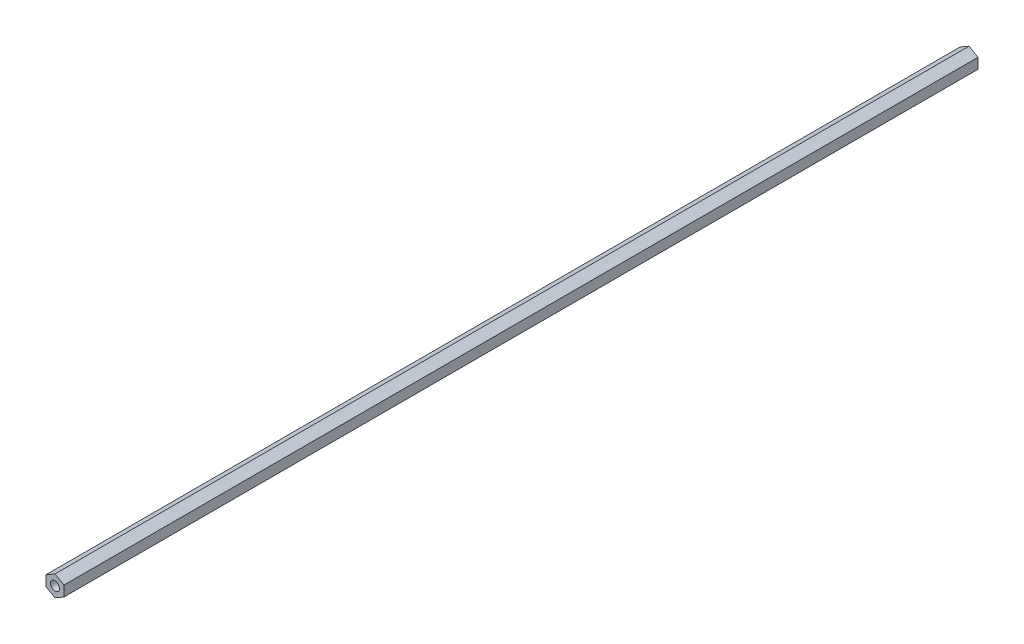
ISO-10303-21;
HEADER;
FILE_DESCRIPTION(('STEP AP214'),'2;1');
FILE_NAME('part.step','',(''),(''),'','','');
FILE_SCHEMA(('AUTOMOTIVE_DESIGN { 1 0 10303 214 1 1 1 1 }'));
ENDSEC;
DATA;
#1=APPLICATION_CONTEXT('core data for automotive mechanical design processes');
#2=APPLICATION_PROTOCOL_DEFINITION('international standard','automotive_design',2000,#1);
#3=PRODUCT_CONTEXT('',#1,'mechanical');
#4=PRODUCT('Part','Part','',(#3));
#5=PRODUCT_RELATED_PRODUCT_CATEGORY('part','',(#4));
#6=PRODUCT_DEFINITION_FORMATION('','',#4);
#7=PRODUCT_DEFINITION_CONTEXT('part definition',#1,'design');
#8=PRODUCT_DEFINITION('design','',#6,#7);
#9=PRODUCT_DEFINITION_SHAPE('','',#8);
#10=(LENGTH_UNIT() NAMED_UNIT(*) SI_UNIT(.MILLI.,.METRE.));
#11=(NAMED_UNIT(*) PLANE_ANGLE_UNIT() SI_UNIT($,.RADIAN.));
#12=(NAMED_UNIT(*) SI_UNIT($,.STERADIAN.) SOLID_ANGLE_UNIT());
#13=UNCERTAINTY_MEASURE_WITH_UNIT(LENGTH_MEASURE(1.E-05),#10,'distance_accuracy_value','');
#14=(GEOMETRIC_REPRESENTATION_CONTEXT(3) GLOBAL_UNCERTAINTY_ASSIGNED_CONTEXT((#13)) GLOBAL_UNIT_ASSIGNED_CONTEXT((#10,
#11,#12)) REPRESENTATION_CONTEXT('',''));
#15=CARTESIAN_POINT('',(0.,0.,0.));
#16=DIRECTION('',(0.,0.,1.));
#17=DIRECTION('',(1.,0.,0.));
#18=AXIS2_PLACEMENT_3D('',#15,#16,#17);
#19=CARTESIAN_POINT('',(-6.35,3.66617420935411,323.85));
#20=DIRECTION('',(1.,0.,0.));
#21=DIRECTION('',(0.,0.,-1.));
#22=AXIS2_PLACEMENT_3D('',#19,#20,#21);
#23=PLANE('',#22);
#24=DIRECTION('',(0.,0.,-1.));
#25=VECTOR('',#24,1.);
#26=CARTESIAN_POINT('',(-6.35,3.66617420935411,323.85));
#27=LINE('',#26,#25);
#28=CARTESIAN_POINT('',(-6.35,3.66617420935411,323.85));
#29=VERTEX_POINT('',#28);
#30=CARTESIAN_POINT('',(-6.35,3.66617420935411,-323.85));
#31=VERTEX_POINT('',#30);
#32=EDGE_CURVE('E140',#29,#31,#27,.T.);
#33=ORIENTED_EDGE('',*,*,#32,.T.);
#34=DIRECTION('',(0.,-1.,0.));
#35=VECTOR('',#34,1.);
#36=CARTESIAN_POINT('',(-6.35,3.66617420935411,-323.85));
#37=LINE('',#36,#35);
#38=CARTESIAN_POINT('',(-6.35,-3.66617420935413,-323.85));
#39=VERTEX_POINT('',#38);
#40=EDGE_CURVE('E112',#31,#39,#37,.T.);
#41=ORIENTED_EDGE('',*,*,#40,.T.);
#42=DIRECTION('',(0.,0.,-1.));
#43=VECTOR('',#42,1.);
#44=CARTESIAN_POINT('',(-6.35,-3.66617420935413,323.85));
#45=LINE('',#44,#43);
#46=CARTESIAN_POINT('',(-6.35,-3.66617420935413,323.85));
#47=VERTEX_POINT('',#46);
#48=EDGE_CURVE('E11',#47,#39,#45,.T.);
#49=ORIENTED_EDGE('',*,*,#48,.F.);
#50=DIRECTION('',(0.,-1.,0.));
#51=VECTOR('',#50,1.);
#52=CARTESIAN_POINT('',(-6.35,3.66617420935411,323.85));
#53=LINE('',#52,#51);
#54=EDGE_CURVE('E130',#29,#47,#53,.T.);
#55=ORIENTED_EDGE('',*,*,#54,.F.);
#56=EDGE_LOOP('',(#33,#41,#49,#55));
#57=FACE_BOUND('',#56,.T.);
#58=ADVANCED_FACE('F36',(#57),#23,.F.);
#59=CARTESIAN_POINT('',(-6.35,-3.66617420935413,323.85));
#60=DIRECTION('',(0.5,0.866025403784439,0.));
#61=DIRECTION('',(-0.866025403784439,0.5,0.));
#62=AXIS2_PLACEMENT_3D('',#59,#60,#61);
#63=PLANE('',#62);
#64=ORIENTED_EDGE('',*,*,#48,.T.);
#65=DIRECTION('',(0.866025403784439,-0.5,0.));
#66=VECTOR('',#65,1.);
#67=CARTESIAN_POINT('',(-6.35,-3.66617420935413,-323.85));
#68=LINE('',#67,#66);
#69=CARTESIAN_POINT('',(0.,-7.33234841870826,-323.85));
#70=VERTEX_POINT('',#69);
#71=EDGE_CURVE('E115',#39,#70,#68,.T.);
#72=ORIENTED_EDGE('',*,*,#71,.T.);
#73=DIRECTION('',(0.,0.,-1.));
#74=VECTOR('',#73,1.);
#75=CARTESIAN_POINT('',(0.,-7.33234841870826,323.85));
#76=LINE('',#75,#74);
#77=CARTESIAN_POINT('',(0.,-7.33234841870826,323.85));
#78=VERTEX_POINT('',#77);
#79=EDGE_CURVE('E43',#78,#70,#76,.T.);
#80=ORIENTED_EDGE('',*,*,#79,.F.);
#81=DIRECTION('',(0.866025403784439,-0.5,0.));
#82=VECTOR('',#81,1.);
#83=CARTESIAN_POINT('',(-6.35,-3.66617420935413,323.85));
#84=LINE('',#83,#82);
#85=EDGE_CURVE('E132',#47,#78,#84,.T.);
#86=ORIENTED_EDGE('',*,*,#85,.F.);
#87=EDGE_LOOP('',(#64,#72,#80,#86));
#88=FACE_BOUND('',#87,.T.);
#89=ADVANCED_FACE('F160',(#88),#63,.F.);
#90=CARTESIAN_POINT('',(0.,-7.33234841870826,323.85));
#91=DIRECTION('',(-0.5,0.866025403784439,0.));
#92=DIRECTION('',(-0.866025403784439,-0.5,0.));
#93=AXIS2_PLACEMENT_3D('',#90,#91,#92);
#94=PLANE('',#93);
#95=ORIENTED_EDGE('',*,*,#79,.T.);
#96=DIRECTION('',(0.866025403784439,0.5,0.));
#97=VECTOR('',#96,1.);
#98=CARTESIAN_POINT('',(0.,-7.33234841870826,-323.85));
#99=LINE('',#98,#97);
#100=CARTESIAN_POINT('',(6.35,-3.66617420935414,-323.85));
#101=VERTEX_POINT('',#100);
#102=EDGE_CURVE('E118',#70,#101,#99,.T.);
#103=ORIENTED_EDGE('',*,*,#102,.T.);
#104=DIRECTION('',(0.,0.,-1.));
#105=VECTOR('',#104,1.);
#106=CARTESIAN_POINT('',(6.35,-3.66617420935414,323.85));
#107=LINE('',#106,#105);
#108=CARTESIAN_POINT('',(6.35,-3.66617420935414,323.85));
#109=VERTEX_POINT('',#108);
#110=EDGE_CURVE('E146',#109,#101,#107,.T.);
#111=ORIENTED_EDGE('',*,*,#110,.F.);
#112=DIRECTION('',(0.866025403784439,0.5,0.));
#113=VECTOR('',#112,1.);
#114=CARTESIAN_POINT('',(0.,-7.33234841870826,323.85));
#115=LINE('',#114,#113);
#116=EDGE_CURVE('E134',#78,#109,#115,.T.);
#117=ORIENTED_EDGE('',*,*,#116,.F.);
#118=EDGE_LOOP('',(#95,#103,#111,#117));
#119=FACE_BOUND('',#118,.T.);
#120=ADVANCED_FACE('F151',(#119),#94,.F.);
#121=CARTESIAN_POINT('',(6.35,-3.66617420935414,323.85));
#122=DIRECTION('',(-1.,0.,0.));
#123=DIRECTION('',(0.,-1.,0.));
#124=AXIS2_PLACEMENT_3D('',#121,#122,#123);
#125=PLANE('',#124);
#126=ORIENTED_EDGE('',*,*,#110,.T.);
#127=DIRECTION('',(0.,1.,0.));
#128=VECTOR('',#127,1.);
#129=CARTESIAN_POINT('',(6.35,-3.66617420935414,-323.85));
#130=LINE('',#129,#128);
#131=CARTESIAN_POINT('',(6.35,3.66617420935412,-323.85));
#132=VERTEX_POINT('',#131);
#133=EDGE_CURVE('E121',#101,#132,#130,.T.);
#134=ORIENTED_EDGE('',*,*,#133,.T.);
#135=DIRECTION('',(0.,0.,-1.));
#136=VECTOR('',#135,1.);
#137=CARTESIAN_POINT('',(6.35,3.66617420935412,323.85));
#138=LINE('',#137,#136);
#139=CARTESIAN_POINT('',(6.35,3.66617420935412,323.85));
#140=VERTEX_POINT('',#139);
#141=EDGE_CURVE('E144',#140,#132,#138,.T.);
#142=ORIENTED_EDGE('',*,*,#141,.F.);
#143=DIRECTION('',(0.,1.,0.));
#144=VECTOR('',#143,1.);
#145=CARTESIAN_POINT('',(6.35,-3.66617420935414,323.85));
#146=LINE('',#145,#144);
#147=EDGE_CURVE('E136',#109,#140,#146,.T.);
#148=ORIENTED_EDGE('',*,*,#147,.F.);
#149=EDGE_LOOP('',(#126,#134,#142,#148));
#150=FACE_BOUND('',#149,.T.);
#151=ADVANCED_FACE('F171',(#150),#125,.F.);
#152=CARTESIAN_POINT('',(6.35,3.66617420935412,323.85));
#153=DIRECTION('',(-0.5,-0.866025403784439,0.));
#154=DIRECTION('',(0.866025403784439,-0.5,0.));
#155=AXIS2_PLACEMENT_3D('',#152,#153,#154);
#156=PLANE('',#155);
#157=ORIENTED_EDGE('',*,*,#141,.T.);
#158=DIRECTION('',(-0.866025403784439,0.5,0.));
#159=VECTOR('',#158,1.);
#160=CARTESIAN_POINT('',(6.35,3.66617420935412,-323.85));
#161=LINE('',#160,#159);
#162=CARTESIAN_POINT('',(0.,7.33234841870824,-323.85));
#163=VERTEX_POINT('',#162);
#164=EDGE_CURVE('E124',#132,#163,#161,.T.);
#165=ORIENTED_EDGE('',*,*,#164,.T.);
#166=DIRECTION('',(0.,0.,-1.));
#167=VECTOR('',#166,1.);
#168=CARTESIAN_POINT('',(0.,7.33234841870824,323.85));
#169=LINE('',#168,#167);
#170=CARTESIAN_POINT('',(0.,7.33234841870824,323.85));
#171=VERTEX_POINT('',#170);
#172=EDGE_CURVE('E142',#171,#163,#169,.T.);
#173=ORIENTED_EDGE('',*,*,#172,.F.);
#174=DIRECTION('',(-0.866025403784439,0.5,0.));
#175=VECTOR('',#174,1.);
#176=CARTESIAN_POINT('',(6.35,3.66617420935412,323.85));
#177=LINE('',#176,#175);
#178=EDGE_CURVE('E55',#140,#171,#177,.T.);
#179=ORIENTED_EDGE('',*,*,#178,.F.);
#180=EDGE_LOOP('',(#157,#165,#173,#179));
#181=FACE_BOUND('',#180,.T.);
#182=ADVANCED_FACE('F168',(#181),#156,.F.);
#183=CARTESIAN_POINT('',(0.,7.33234841870824,323.85));
#184=DIRECTION('',(0.5,-0.866025403784439,0.));
#185=DIRECTION('',(0.866025403784439,0.5,0.));
#186=AXIS2_PLACEMENT_3D('',#183,#184,#185);
#187=PLANE('',#186);
#188=ORIENTED_EDGE('',*,*,#172,.T.);
#189=DIRECTION('',(-0.866025403784439,-0.5,0.));
#190=VECTOR('',#189,1.);
#191=CARTESIAN_POINT('',(0.,7.33234841870824,-323.85));
#192=LINE('',#191,#190);
#193=EDGE_CURVE('E127',#163,#31,#192,.T.);
#194=ORIENTED_EDGE('',*,*,#193,.T.);
#195=ORIENTED_EDGE('',*,*,#32,.F.);
#196=DIRECTION('',(-0.866025403784439,-0.5,0.));
#197=VECTOR('',#196,1.);
#198=CARTESIAN_POINT('',(0.,7.33234841870824,323.85));
#199=LINE('',#198,#197);
#200=EDGE_CURVE('E50',#171,#29,#199,.T.);
#201=ORIENTED_EDGE('',*,*,#200,.F.);
#202=EDGE_LOOP('',(#188,#194,#195,#201));
#203=FACE_BOUND('',#202,.T.);
#204=ADVANCED_FACE('F166',(#203),#187,.F.);
#205=CARTESIAN_POINT('',(0.,0.,323.85));
#206=DIRECTION('',(0.,0.,1.));
#207=DIRECTION('',(1.,0.,0.));
#208=AXIS2_PLACEMENT_3D('',#205,#206,#207);
#209=PLANE('',#208);
#210=CARTESIAN_POINT('',(0.,0.,323.85));
#211=DIRECTION('',(0.,0.,1.));
#212=DIRECTION('',(1.,0.,0.));
#213=AXIS2_PLACEMENT_3D('',#210,#211,#212);
#214=CIRCLE('',#213,3.17499999999999);
#215=CARTESIAN_POINT('',(3.17499999999999,0.,323.85));
#216=VERTEX_POINT('',#215);
#217=EDGE_CURVE('E101',#216,#216,#214,.T.);
#218=ORIENTED_EDGE('',*,*,#217,.F.);
#219=EDGE_LOOP('',(#218));
#220=FACE_BOUND('',#219,.T.);
#221=ORIENTED_EDGE('',*,*,#54,.T.);
#222=ORIENTED_EDGE('',*,*,#85,.T.);
#223=ORIENTED_EDGE('',*,*,#116,.T.);
#224=ORIENTED_EDGE('',*,*,#147,.T.);
#225=ORIENTED_EDGE('',*,*,#178,.T.);
#226=ORIENTED_EDGE('',*,*,#200,.T.);
#227=EDGE_LOOP('',(#221,#222,#223,#224,#225,#226));
#228=FACE_BOUND('',#227,.T.);
#229=ADVANCED_FACE('F173',(#220,#228),#209,.T.);
#230=CARTESIAN_POINT('',(0.,0.,-323.85));
#231=DIRECTION('',(0.,0.,1.));
#232=DIRECTION('',(1.,0.,0.));
#233=AXIS2_PLACEMENT_3D('',#230,#231,#232);
#234=PLANE('',#233);
#235=CARTESIAN_POINT('',(0.,0.,-323.85));
#236=DIRECTION('',(0.,0.,-1.));
#237=DIRECTION('',(-1.,0.,0.));
#238=AXIS2_PLACEMENT_3D('',#235,#236,#237);
#239=CIRCLE('',#238,3.17499999999999);
#240=CARTESIAN_POINT('',(-3.17499999999999,0.,-323.85));
#241=VERTEX_POINT('',#240);
#242=EDGE_CURVE('E102',#241,#241,#239,.T.);
#243=ORIENTED_EDGE('',*,*,#242,.F.);
#244=EDGE_LOOP('',(#243));
#245=FACE_BOUND('',#244,.T.);
#246=ORIENTED_EDGE('',*,*,#40,.F.);
#247=ORIENTED_EDGE('',*,*,#193,.F.);
#248=ORIENTED_EDGE('',*,*,#164,.F.);
#249=ORIENTED_EDGE('',*,*,#133,.F.);
#250=ORIENTED_EDGE('',*,*,#102,.F.);
#251=ORIENTED_EDGE('',*,*,#71,.F.);
#252=EDGE_LOOP('',(#246,#247,#248,#249,#250,#251));
#253=FACE_BOUND('',#252,.T.);
#254=ADVANCED_FACE('F158',(#245,#253),#234,.F.);
#255=CARTESIAN_POINT('',(0.,0.,298.45));
#256=DIRECTION('',(0.,0.,1.));
#257=DIRECTION('',(1.,0.,0.));
#258=AXIS2_PLACEMENT_3D('',#255,#256,#257);
#259=CONICAL_SURFACE('',#258,3.17499999999995,1.02974425867665);
#260=CARTESIAN_POINT('',(0.,0.,296.542267534587));
#261=VERTEX_POINT('',#260);
#262=VERTEX_LOOP('',#261);
#263=FACE_BOUND('',#262,.T.);
#264=CARTESIAN_POINT('',(0.,0.,298.45));
#265=DIRECTION('',(0.,0.,1.));
#266=DIRECTION('',(1.,0.,0.));
#267=AXIS2_PLACEMENT_3D('',#264,#265,#266);
#268=CIRCLE('',#267,3.17499999999995);
#269=CARTESIAN_POINT('',(3.17499999999995,0.,298.45));
#270=VERTEX_POINT('',#269);
#271=EDGE_CURVE('E105',#270,#270,#268,.T.);
#272=ORIENTED_EDGE('',*,*,#271,.T.);
#273=EDGE_LOOP('',(#272));
#274=FACE_BOUND('',#273,.T.);
#275=ADVANCED_FACE('F181',(#263,#274),#259,.F.);
#276=CARTESIAN_POINT('',(0.,0.,323.85));
#277=DIRECTION('',(0.,0.,1.));
#278=DIRECTION('',(1.,0.,0.));
#279=AXIS2_PLACEMENT_3D('',#276,#277,#278);
#280=CYLINDRICAL_SURFACE('',#279,3.17499999999997);
#281=ORIENTED_EDGE('',*,*,#271,.F.);
#282=EDGE_LOOP('',(#281));
#283=FACE_BOUND('',#282,.T.);
#284=ORIENTED_EDGE('',*,*,#217,.T.);
#285=EDGE_LOOP('',(#284));
#286=FACE_BOUND('',#285,.T.);
#287=ADVANCED_FACE('F95',(#283,#286),#280,.F.);
#288=CARTESIAN_POINT('',(0.,0.,-298.45));
#289=DIRECTION('',(0.,0.,-1.));
#290=DIRECTION('',(-1.,0.,0.));
#291=AXIS2_PLACEMENT_3D('',#288,#289,#290);
#292=CONICAL_SURFACE('',#291,3.17499999999995,1.02974425867665);
#293=CARTESIAN_POINT('',(0.,0.,-296.542267534587));
#294=VERTEX_POINT('',#293);
#295=VERTEX_LOOP('',#294);
#296=FACE_BOUND('',#295,.T.);
#297=CARTESIAN_POINT('',(0.,0.,-298.45));
#298=DIRECTION('',(0.,0.,-1.));
#299=DIRECTION('',(-1.,0.,0.));
#300=AXIS2_PLACEMENT_3D('',#297,#298,#299);
#301=CIRCLE('',#300,3.17499999999995);
#302=CARTESIAN_POINT('',(-3.17499999999995,0.,-298.45));
#303=VERTEX_POINT('',#302);
#304=EDGE_CURVE('E99',#303,#303,#301,.T.);
#305=ORIENTED_EDGE('',*,*,#304,.T.);
#306=EDGE_LOOP('',(#305));
#307=FACE_BOUND('',#306,.T.);
#308=ADVANCED_FACE('F91',(#296,#307),#292,.F.);
#309=CARTESIAN_POINT('',(0.,0.,-323.85));
#310=DIRECTION('',(0.,0.,-1.));
#311=DIRECTION('',(-1.,0.,0.));
#312=AXIS2_PLACEMENT_3D('',#309,#310,#311);
#313=CYLINDRICAL_SURFACE('',#312,3.17499999999997);
#314=ORIENTED_EDGE('',*,*,#304,.F.);
#315=EDGE_LOOP('',(#314));
#316=FACE_BOUND('',#315,.T.);
#317=ORIENTED_EDGE('',*,*,#242,.T.);
#318=EDGE_LOOP('',(#317));
#319=FACE_BOUND('',#318,.T.);
#320=ADVANCED_FACE('F94',(#316,#319),#313,.F.);
#321=CLOSED_SHELL('',(#58,#89,#120,#151,#182,#204,#229,#254,#275,#287,#308,#320));
#322=MANIFOLD_SOLID_BREP('B2',#321);
#323=ADVANCED_BREP_SHAPE_REPRESENTATION('',(#18,#322),#14);
#324=SHAPE_DEFINITION_REPRESENTATION(#9,#323);
ENDSEC;
END-ISO-10303-21;
